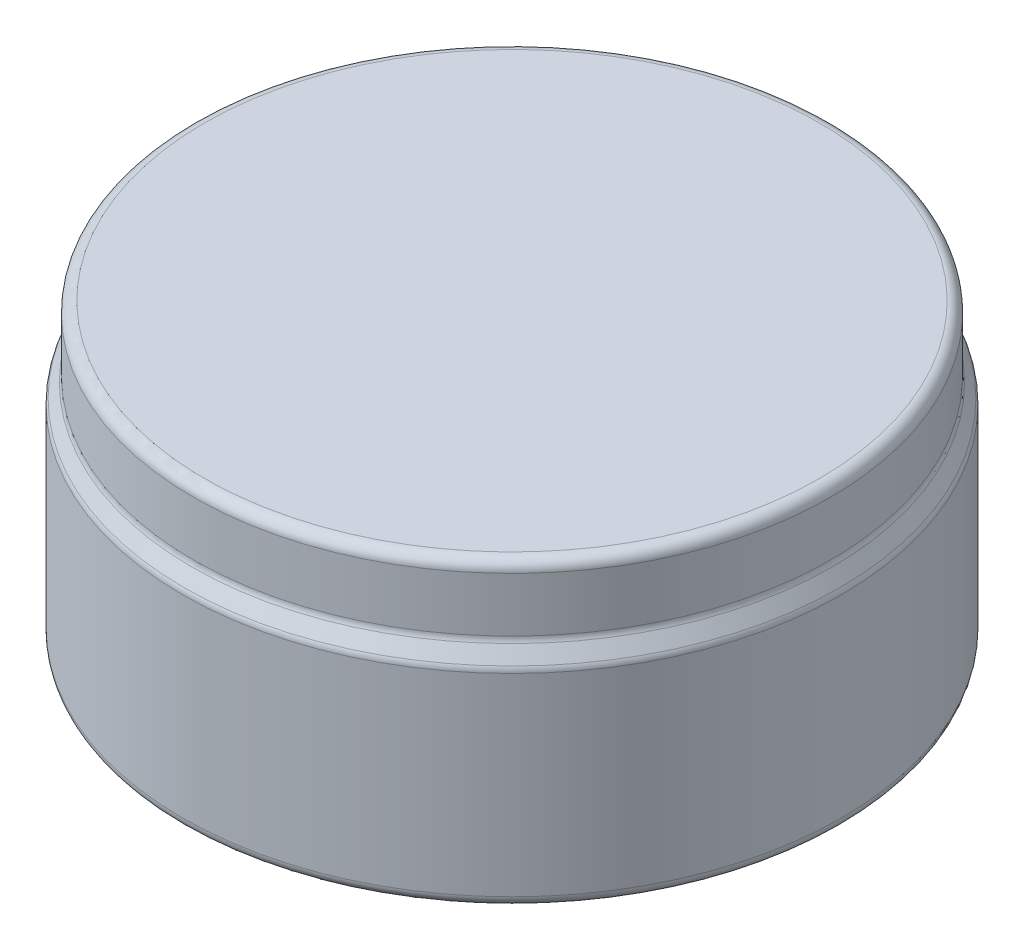
ISO-10303-21;
HEADER;
FILE_DESCRIPTION(('STEP AP214'),'2;1');
FILE_NAME('part.step','',(''),(''),'','','');
FILE_SCHEMA(('AUTOMOTIVE_DESIGN { 1 0 10303 214 1 1 1 1 }'));
ENDSEC;
DATA;
#1=APPLICATION_CONTEXT('core data for automotive mechanical design processes');
#2=APPLICATION_PROTOCOL_DEFINITION('international standard','automotive_design',2000,#1);
#3=PRODUCT_CONTEXT('',#1,'mechanical');
#4=PRODUCT('Part','Part','',(#3));
#5=PRODUCT_RELATED_PRODUCT_CATEGORY('part','',(#4));
#6=PRODUCT_DEFINITION_FORMATION('','',#4);
#7=PRODUCT_DEFINITION_CONTEXT('part definition',#1,'design');
#8=PRODUCT_DEFINITION('design','',#6,#7);
#9=PRODUCT_DEFINITION_SHAPE('','',#8);
#10=(LENGTH_UNIT() NAMED_UNIT(*) SI_UNIT(.MILLI.,.METRE.));
#11=(NAMED_UNIT(*) PLANE_ANGLE_UNIT() SI_UNIT($,.RADIAN.));
#12=(NAMED_UNIT(*) SI_UNIT($,.STERADIAN.) SOLID_ANGLE_UNIT());
#13=UNCERTAINTY_MEASURE_WITH_UNIT(LENGTH_MEASURE(1.E-05),#10,'distance_accuracy_value','');
#14=(GEOMETRIC_REPRESENTATION_CONTEXT(3) GLOBAL_UNCERTAINTY_ASSIGNED_CONTEXT((#13)) GLOBAL_UNIT_ASSIGNED_CONTEXT((#10,
#11,#12)) REPRESENTATION_CONTEXT('',''));
#15=CARTESIAN_POINT('',(0.,0.,0.));
#16=DIRECTION('',(0.,0.,1.));
#17=DIRECTION('',(1.,0.,0.));
#18=AXIS2_PLACEMENT_3D('',#15,#16,#17);
#19=CARTESIAN_POINT('',(0.,0.,0.));
#20=DIRECTION('',(0.,-1.,0.));
#21=DIRECTION('',(1.,0.,0.));
#22=AXIS2_PLACEMENT_3D('',#19,#20,#21);
#23=PLANE('',#22);
#24=CARTESIAN_POINT('',(0.,0.,0.));
#25=DIRECTION('',(0.,-1.,0.));
#26=DIRECTION('',(1.,0.,0.));
#27=AXIS2_PLACEMENT_3D('',#24,#25,#26);
#28=CIRCLE('',#27,5.85);
#29=CARTESIAN_POINT('',(5.85,0.,0.));
#30=VERTEX_POINT('',#29);
#31=EDGE_CURVE('E68',#30,#30,#28,.T.);
#32=ORIENTED_EDGE('',*,*,#31,.T.);
#33=EDGE_LOOP('',(#32));
#34=FACE_BOUND('',#33,.T.);
#35=ADVANCED_FACE('F42',(#34),#23,.T.);
#36=CARTESIAN_POINT('',(0.,5.4,0.));
#37=DIRECTION('',(0.,1.,0.));
#38=DIRECTION('',(-1.,0.,0.));
#39=AXIS2_PLACEMENT_3D('',#36,#37,#38);
#40=CYLINDRICAL_SURFACE('',#39,6.05);
#41=CARTESIAN_POINT('',(0.,3.75,0.));
#42=DIRECTION('',(0.,-1.,0.));
#43=DIRECTION('',(1.,0.,0.));
#44=AXIS2_PLACEMENT_3D('',#41,#42,#43);
#45=CIRCLE('',#44,6.05);
#46=CARTESIAN_POINT('',(6.05,3.75,0.));
#47=VERTEX_POINT('',#46);
#48=EDGE_CURVE('E10',#47,#47,#45,.T.);
#49=ORIENTED_EDGE('',*,*,#48,.T.);
#50=EDGE_LOOP('',(#49));
#51=FACE_BOUND('',#50,.T.);
#52=CARTESIAN_POINT('',(0.,0.2,0.));
#53=DIRECTION('',(0.,-1.,0.));
#54=DIRECTION('',(1.,0.,0.));
#55=AXIS2_PLACEMENT_3D('',#52,#53,#54);
#56=CIRCLE('',#55,6.05);
#57=CARTESIAN_POINT('',(6.05,0.2,0.));
#58=VERTEX_POINT('',#57);
#59=EDGE_CURVE('E72',#58,#58,#56,.F.);
#60=ORIENTED_EDGE('',*,*,#59,.T.);
#61=EDGE_LOOP('',(#60));
#62=FACE_BOUND('',#61,.T.);
#63=ADVANCED_FACE('F103',(#51,#62),#40,.T.);
#64=CARTESIAN_POINT('',(0.,4.15,0.));
#65=DIRECTION('',(0.,-1.,0.));
#66=DIRECTION('',(1.,0.,0.));
#67=AXIS2_PLACEMENT_3D('',#64,#65,#66);
#68=CONICAL_SURFACE('',#67,5.85,0.5235987755983);
#69=CARTESIAN_POINT('',(0.,4.10358983848622,0.));
#70=DIRECTION('',(0.,-1.,0.));
#71=DIRECTION('',(1.,0.,0.));
#72=AXIS2_PLACEMENT_3D('',#69,#70,#71);
#73=CIRCLE('',#72,5.87679491924311);
#74=CARTESIAN_POINT('',(5.87679491924311,4.10358983848622,0.));
#75=VERTEX_POINT('',#74);
#76=EDGE_CURVE('E50',#75,#75,#73,.T.);
#77=ORIENTED_EDGE('',*,*,#76,.T.);
#78=EDGE_LOOP('',(#77));
#79=FACE_BOUND('',#78,.T.);
#80=CARTESIAN_POINT('',(0.,3.85,0.));
#81=DIRECTION('',(0.,1.,0.));
#82=DIRECTION('',(-1.,0.,0.));
#83=AXIS2_PLACEMENT_3D('',#80,#81,#82);
#84=CIRCLE('',#83,6.02320508075689);
#85=CARTESIAN_POINT('',(-6.02320508075689,3.85,0.));
#86=VERTEX_POINT('',#85);
#87=EDGE_CURVE('E56',#86,#86,#84,.T.);
#88=ORIENTED_EDGE('',*,*,#87,.T.);
#89=EDGE_LOOP('',(#88));
#90=FACE_BOUND('',#89,.T.);
#91=ADVANCED_FACE('F99',(#79,#90),#68,.T.);
#92=CARTESIAN_POINT('',(0.,5.4,0.));
#93=DIRECTION('',(0.,1.,0.));
#94=DIRECTION('',(-1.,0.,0.));
#95=AXIS2_PLACEMENT_3D('',#92,#93,#94);
#96=CYLINDRICAL_SURFACE('',#95,5.85);
#97=CARTESIAN_POINT('',(0.,4.20358983848622,0.));
#98=DIRECTION('',(0.,1.,0.));
#99=DIRECTION('',(-1.,0.,0.));
#100=AXIS2_PLACEMENT_3D('',#97,#98,#99);
#101=CIRCLE('',#100,5.85);
#102=CARTESIAN_POINT('',(-5.85,4.20358983848622,0.));
#103=VERTEX_POINT('',#102);
#104=EDGE_CURVE('E62',#103,#103,#101,.T.);
#105=ORIENTED_EDGE('',*,*,#104,.T.);
#106=EDGE_LOOP('',(#105));
#107=FACE_BOUND('',#106,.T.);
#108=CARTESIAN_POINT('',(0.,5.2,0.));
#109=DIRECTION('',(0.,1.,0.));
#110=DIRECTION('',(-1.,0.,0.));
#111=AXIS2_PLACEMENT_3D('',#108,#109,#110);
#112=CIRCLE('',#111,5.85);
#113=CARTESIAN_POINT('',(-5.85,5.2,0.));
#114=VERTEX_POINT('',#113);
#115=EDGE_CURVE('E76',#114,#114,#112,.T.);
#116=ORIENTED_EDGE('',*,*,#115,.F.);
#117=EDGE_LOOP('',(#116));
#118=FACE_BOUND('',#117,.T.);
#119=ADVANCED_FACE('F90',(#107,#118),#96,.T.);
#120=CARTESIAN_POINT('',(0.,5.2,0.));
#121=DIRECTION('',(0.,1.,0.));
#122=DIRECTION('',(-1.,0.,0.));
#123=AXIS2_PLACEMENT_3D('',#120,#121,#122);
#124=TOROIDAL_SURFACE('',#123,5.65,0.2);
#125=ORIENTED_EDGE('',*,*,#115,.T.);
#126=EDGE_LOOP('',(#125));
#127=FACE_BOUND('',#126,.T.);
#128=CARTESIAN_POINT('',(0.,5.4,0.));
#129=DIRECTION('',(0.,1.,0.));
#130=DIRECTION('',(-1.,0.,0.));
#131=AXIS2_PLACEMENT_3D('',#128,#129,#130);
#132=CIRCLE('',#131,5.65);
#133=CARTESIAN_POINT('',(-5.65,5.4,0.));
#134=VERTEX_POINT('',#133);
#135=EDGE_CURVE('E80',#134,#134,#132,.T.);
#136=ORIENTED_EDGE('',*,*,#135,.F.);
#137=EDGE_LOOP('',(#136));
#138=FACE_BOUND('',#137,.T.);
#139=ADVANCED_FACE('F88',(#127,#138),#124,.T.);
#140=CARTESIAN_POINT('',(-5.65,5.4,0.));
#141=DIRECTION('',(0.,1.,0.));
#142=DIRECTION('',(-1.,0.,0.));
#143=AXIS2_PLACEMENT_3D('',#140,#141,#142);
#144=PLANE('',#143);
#145=ORIENTED_EDGE('',*,*,#135,.T.);
#146=EDGE_LOOP('',(#145));
#147=FACE_BOUND('',#146,.T.);
#148=ADVANCED_FACE('F86',(#147),#144,.T.);
#149=CARTESIAN_POINT('',(0.,0.2,0.));
#150=DIRECTION('',(0.,-1.,0.));
#151=DIRECTION('',(1.,0.,0.));
#152=AXIS2_PLACEMENT_3D('',#149,#150,#151);
#153=TOROIDAL_SURFACE('',#152,5.85,0.2);
#154=ORIENTED_EDGE('',*,*,#31,.F.);
#155=EDGE_LOOP('',(#154));
#156=FACE_BOUND('',#155,.T.);
#157=ORIENTED_EDGE('',*,*,#59,.F.);
#158=EDGE_LOOP('',(#157));
#159=FACE_BOUND('',#158,.T.);
#160=ADVANCED_FACE('F97',(#156,#159),#153,.T.);
#161=CARTESIAN_POINT('',(0.,4.20358983848622,0.));
#162=DIRECTION('',(0.,1.,0.));
#163=DIRECTION('',(-1.,0.,0.));
#164=AXIS2_PLACEMENT_3D('',#161,#162,#163);
#165=TOROIDAL_SURFACE('',#164,6.05,0.2);
#166=ORIENTED_EDGE('',*,*,#76,.F.);
#167=EDGE_LOOP('',(#166));
#168=FACE_BOUND('',#167,.T.);
#169=ORIENTED_EDGE('',*,*,#104,.F.);
#170=EDGE_LOOP('',(#169));
#171=FACE_BOUND('',#170,.T.);
#172=ADVANCED_FACE('F113',(#168,#171),#165,.F.);
#173=CARTESIAN_POINT('',(0.,3.75,0.));
#174=DIRECTION('',(0.,-1.,0.));
#175=DIRECTION('',(1.,0.,0.));
#176=AXIS2_PLACEMENT_3D('',#173,#174,#175);
#177=TOROIDAL_SURFACE('',#176,5.85,0.2);
#178=ORIENTED_EDGE('',*,*,#48,.F.);
#179=EDGE_LOOP('',(#178));
#180=FACE_BOUND('',#179,.T.);
#181=ORIENTED_EDGE('',*,*,#87,.F.);
#182=EDGE_LOOP('',(#181));
#183=FACE_BOUND('',#182,.T.);
#184=ADVANCED_FACE('F44',(#180,#183),#177,.T.);
#185=CLOSED_SHELL('',(#35,#63,#91,#119,#139,#148,#160,#172,#184));
#186=MANIFOLD_SOLID_BREP('B2',#185);
#187=ADVANCED_BREP_SHAPE_REPRESENTATION('',(#18,#186),#14);
#188=SHAPE_DEFINITION_REPRESENTATION(#9,#187);
ENDSEC;
END-ISO-10303-21;
